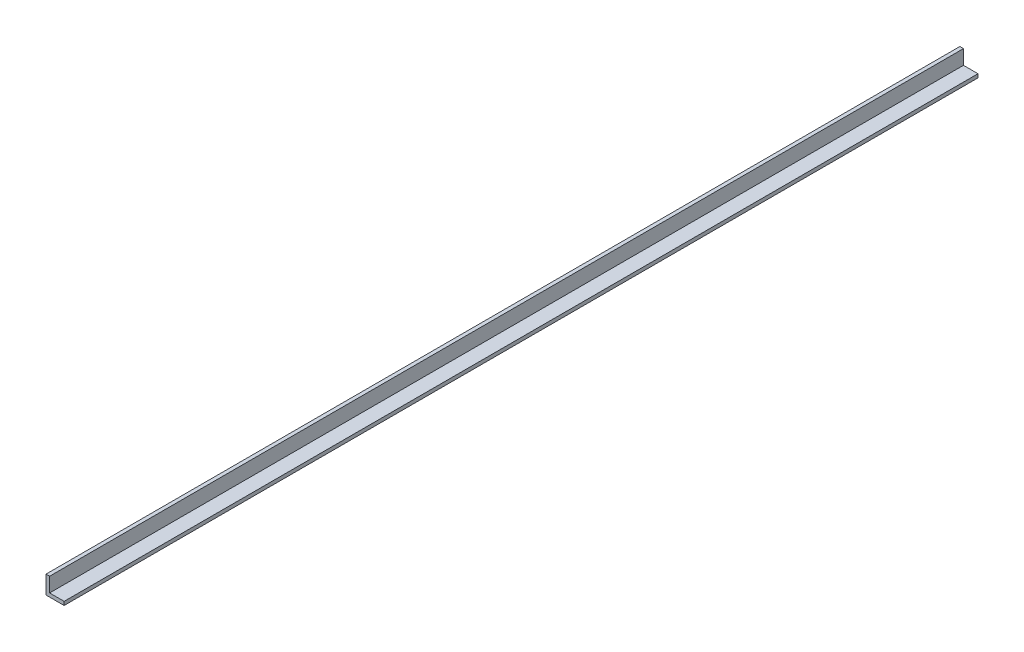
ISO-10303-21;
HEADER;
FILE_DESCRIPTION(('STEP AP214'),'2;1');
FILE_NAME('part.step','',(''),(''),'','','');
FILE_SCHEMA(('AUTOMOTIVE_DESIGN { 1 0 10303 214 1 1 1 1 }'));
ENDSEC;
DATA;
#1=APPLICATION_CONTEXT('core data for automotive mechanical design processes');
#2=APPLICATION_PROTOCOL_DEFINITION('international standard','automotive_design',2000,#1);
#3=PRODUCT_CONTEXT('',#1,'mechanical');
#4=PRODUCT('Part','Part','',(#3));
#5=PRODUCT_RELATED_PRODUCT_CATEGORY('part','',(#4));
#6=PRODUCT_DEFINITION_FORMATION('','',#4);
#7=PRODUCT_DEFINITION_CONTEXT('part definition',#1,'design');
#8=PRODUCT_DEFINITION('design','',#6,#7);
#9=PRODUCT_DEFINITION_SHAPE('','',#8);
#10=(LENGTH_UNIT() NAMED_UNIT(*) SI_UNIT(.MILLI.,.METRE.));
#11=(NAMED_UNIT(*) PLANE_ANGLE_UNIT() SI_UNIT($,.RADIAN.));
#12=(NAMED_UNIT(*) SI_UNIT($,.STERADIAN.) SOLID_ANGLE_UNIT());
#13=UNCERTAINTY_MEASURE_WITH_UNIT(LENGTH_MEASURE(1.E-05),#10,'distance_accuracy_value','');
#14=(GEOMETRIC_REPRESENTATION_CONTEXT(3) GLOBAL_UNCERTAINTY_ASSIGNED_CONTEXT((#13)) GLOBAL_UNIT_ASSIGNED_CONTEXT((#10,
#11,#12)) REPRESENTATION_CONTEXT('',''));
#15=CARTESIAN_POINT('',(0.,0.,0.));
#16=DIRECTION('',(0.,0.,1.));
#17=DIRECTION('',(1.,0.,0.));
#18=AXIS2_PLACEMENT_3D('',#15,#16,#17);
#19=CARTESIAN_POINT('',(-5.99999999999999,20.,1008.));
#20=DIRECTION('',(0.,-1.,0.));
#21=DIRECTION('',(1.,0.,0.));
#22=AXIS2_PLACEMENT_3D('',#19,#20,#21);
#23=PLANE('',#22);
#24=DIRECTION('',(-1.,0.,0.));
#25=VECTOR('',#24,1.);
#26=CARTESIAN_POINT('',(-5.99999999999999,20.,0.));
#27=LINE('',#26,#25);
#28=CARTESIAN_POINT('',(-5.99999999999999,20.,0.));
#29=VERTEX_POINT('',#28);
#30=CARTESIAN_POINT('',(-10.,20.,0.));
#31=VERTEX_POINT('',#30);
#32=EDGE_CURVE('E117',#29,#31,#27,.T.);
#33=ORIENTED_EDGE('',*,*,#32,.T.);
#34=DIRECTION('',(0.,0.,-1.));
#35=VECTOR('',#34,1.);
#36=CARTESIAN_POINT('',(-10.,20.,1008.));
#37=LINE('',#36,#35);
#38=CARTESIAN_POINT('',(-10.,20.,1008.));
#39=VERTEX_POINT('',#38);
#40=EDGE_CURVE('E11',#39,#31,#37,.T.);
#41=ORIENTED_EDGE('',*,*,#40,.F.);
#42=DIRECTION('',(-1.,0.,0.));
#43=VECTOR('',#42,1.);
#44=CARTESIAN_POINT('',(-5.99999999999999,20.,1008.));
#45=LINE('',#44,#43);
#46=CARTESIAN_POINT('',(-5.99999999999999,20.,1008.));
#47=VERTEX_POINT('',#46);
#48=EDGE_CURVE('E127',#47,#39,#45,.T.);
#49=ORIENTED_EDGE('',*,*,#48,.F.);
#50=DIRECTION('',(0.,0.,-1.));
#51=VECTOR('',#50,1.);
#52=CARTESIAN_POINT('',(-5.99999999999999,20.,1008.));
#53=LINE('',#52,#51);
#54=EDGE_CURVE('E113',#47,#29,#53,.T.);
#55=ORIENTED_EDGE('',*,*,#54,.T.);
#56=EDGE_LOOP('',(#33,#41,#49,#55));
#57=FACE_BOUND('',#56,.T.);
#58=ADVANCED_FACE('F33',(#57),#23,.F.);
#59=CARTESIAN_POINT('',(-10.,20.,1008.));
#60=DIRECTION('',(1.,0.,0.));
#61=DIRECTION('',(0.,1.,0.));
#62=AXIS2_PLACEMENT_3D('',#59,#60,#61);
#63=PLANE('',#62);
#64=DIRECTION('',(0.,-1.,0.));
#65=VECTOR('',#64,1.);
#66=CARTESIAN_POINT('',(-10.,20.,0.));
#67=LINE('',#66,#65);
#68=CARTESIAN_POINT('',(-10.,0.,0.));
#69=VERTEX_POINT('',#68);
#70=EDGE_CURVE('E120',#31,#69,#67,.T.);
#71=ORIENTED_EDGE('',*,*,#70,.T.);
#72=DIRECTION('',(0.,0.,-1.));
#73=VECTOR('',#72,1.);
#74=CARTESIAN_POINT('',(-10.,0.,1008.));
#75=LINE('',#74,#73);
#76=CARTESIAN_POINT('',(-10.,0.,1008.));
#77=VERTEX_POINT('',#76);
#78=EDGE_CURVE('E41',#77,#69,#75,.T.);
#79=ORIENTED_EDGE('',*,*,#78,.F.);
#80=DIRECTION('',(0.,-1.,0.));
#81=VECTOR('',#80,1.);
#82=CARTESIAN_POINT('',(-10.,20.,1008.));
#83=LINE('',#82,#81);
#84=EDGE_CURVE('E86',#39,#77,#83,.T.);
#85=ORIENTED_EDGE('',*,*,#84,.F.);
#86=ORIENTED_EDGE('',*,*,#40,.T.);
#87=EDGE_LOOP('',(#71,#79,#85,#86));
#88=FACE_BOUND('',#87,.T.);
#89=ADVANCED_FACE('F151',(#88),#63,.F.);
#90=CARTESIAN_POINT('',(-10.,0.,1008.));
#91=DIRECTION('',(0.,1.,0.));
#92=DIRECTION('',(-1.,0.,0.));
#93=AXIS2_PLACEMENT_3D('',#90,#91,#92);
#94=PLANE('',#93);
#95=DIRECTION('',(1.,0.,0.));
#96=VECTOR('',#95,1.);
#97=CARTESIAN_POINT('',(-10.,0.,0.));
#98=LINE('',#97,#96);
#99=CARTESIAN_POINT('',(10.,0.,0.));
#100=VERTEX_POINT('',#99);
#101=EDGE_CURVE('E122',#69,#100,#98,.T.);
#102=ORIENTED_EDGE('',*,*,#101,.T.);
#103=DIRECTION('',(0.,0.,-1.));
#104=VECTOR('',#103,1.);
#105=CARTESIAN_POINT('',(10.,0.,1008.));
#106=LINE('',#105,#104);
#107=CARTESIAN_POINT('',(10.,0.,1008.));
#108=VERTEX_POINT('',#107);
#109=EDGE_CURVE('E108',#108,#100,#106,.T.);
#110=ORIENTED_EDGE('',*,*,#109,.F.);
#111=DIRECTION('',(1.,0.,0.));
#112=VECTOR('',#111,1.);
#113=CARTESIAN_POINT('',(-10.,0.,1008.));
#114=LINE('',#113,#112);
#115=EDGE_CURVE('E99',#77,#108,#114,.T.);
#116=ORIENTED_EDGE('',*,*,#115,.F.);
#117=ORIENTED_EDGE('',*,*,#78,.T.);
#118=EDGE_LOOP('',(#102,#110,#116,#117));
#119=FACE_BOUND('',#118,.T.);
#120=ADVANCED_FACE('F133',(#119),#94,.F.);
#121=CARTESIAN_POINT('',(10.,0.,1008.));
#122=DIRECTION('',(-1.,0.,0.));
#123=DIRECTION('',(0.,0.,1.));
#124=AXIS2_PLACEMENT_3D('',#121,#122,#123);
#125=PLANE('',#124);
#126=DIRECTION('',(0.,1.,0.));
#127=VECTOR('',#126,1.);
#128=CARTESIAN_POINT('',(10.,0.,0.));
#129=LINE('',#128,#127);
#130=CARTESIAN_POINT('',(10.,4.,0.));
#131=VERTEX_POINT('',#130);
#132=EDGE_CURVE('E107',#100,#131,#129,.T.);
#133=ORIENTED_EDGE('',*,*,#132,.T.);
#134=DIRECTION('',(0.,0.,-1.));
#135=VECTOR('',#134,1.);
#136=CARTESIAN_POINT('',(10.,4.,1008.));
#137=LINE('',#136,#135);
#138=CARTESIAN_POINT('',(10.,4.,1008.));
#139=VERTEX_POINT('',#138);
#140=EDGE_CURVE('E104',#139,#131,#137,.T.);
#141=ORIENTED_EDGE('',*,*,#140,.F.);
#142=DIRECTION('',(0.,1.,0.));
#143=VECTOR('',#142,1.);
#144=CARTESIAN_POINT('',(10.,0.,1008.));
#145=LINE('',#144,#143);
#146=EDGE_CURVE('E93',#108,#139,#145,.T.);
#147=ORIENTED_EDGE('',*,*,#146,.F.);
#148=ORIENTED_EDGE('',*,*,#109,.T.);
#149=EDGE_LOOP('',(#133,#141,#147,#148));
#150=FACE_BOUND('',#149,.T.);
#151=ADVANCED_FACE('F105',(#150),#125,.F.);
#152=CARTESIAN_POINT('',(10.,4.,1008.));
#153=DIRECTION('',(0.,-1.,0.));
#154=DIRECTION('',(0.,0.,-1.));
#155=AXIS2_PLACEMENT_3D('',#152,#153,#154);
#156=PLANE('',#155);
#157=DIRECTION('',(-1.,0.,0.));
#158=VECTOR('',#157,1.);
#159=CARTESIAN_POINT('',(10.,4.,0.));
#160=LINE('',#159,#158);
#161=CARTESIAN_POINT('',(-5.99999999999999,4.,0.));
#162=VERTEX_POINT('',#161);
#163=EDGE_CURVE('E72',#131,#162,#160,.T.);
#164=ORIENTED_EDGE('',*,*,#163,.T.);
#165=DIRECTION('',(0.,0.,-1.));
#166=VECTOR('',#165,1.);
#167=CARTESIAN_POINT('',(-5.99999999999999,4.,1008.));
#168=LINE('',#167,#166);
#169=CARTESIAN_POINT('',(-5.99999999999999,4.,1008.));
#170=VERTEX_POINT('',#169);
#171=EDGE_CURVE('E109',#170,#162,#168,.T.);
#172=ORIENTED_EDGE('',*,*,#171,.F.);
#173=DIRECTION('',(-1.,0.,0.));
#174=VECTOR('',#173,1.);
#175=CARTESIAN_POINT('',(10.,4.,1008.));
#176=LINE('',#175,#174);
#177=EDGE_CURVE('E97',#139,#170,#176,.T.);
#178=ORIENTED_EDGE('',*,*,#177,.F.);
#179=ORIENTED_EDGE('',*,*,#140,.T.);
#180=EDGE_LOOP('',(#164,#172,#178,#179));
#181=FACE_BOUND('',#180,.T.);
#182=ADVANCED_FACE('F111',(#181),#156,.F.);
#183=CARTESIAN_POINT('',(-5.99999999999999,4.,1008.));
#184=DIRECTION('',(-1.,0.,0.));
#185=DIRECTION('',(0.,0.,1.));
#186=AXIS2_PLACEMENT_3D('',#183,#184,#185);
#187=PLANE('',#186);
#188=DIRECTION('',(0.,1.,0.));
#189=VECTOR('',#188,1.);
#190=CARTESIAN_POINT('',(-5.99999999999999,4.,0.));
#191=LINE('',#190,#189);
#192=EDGE_CURVE('E78',#162,#29,#191,.T.);
#193=ORIENTED_EDGE('',*,*,#192,.T.);
#194=ORIENTED_EDGE('',*,*,#54,.F.);
#195=DIRECTION('',(0.,1.,0.));
#196=VECTOR('',#195,1.);
#197=CARTESIAN_POINT('',(-5.99999999999999,4.,1008.));
#198=LINE('',#197,#196);
#199=EDGE_CURVE('E49',#170,#47,#198,.T.);
#200=ORIENTED_EDGE('',*,*,#199,.F.);
#201=ORIENTED_EDGE('',*,*,#171,.T.);
#202=EDGE_LOOP('',(#193,#194,#200,#201));
#203=FACE_BOUND('',#202,.T.);
#204=ADVANCED_FACE('F140',(#203),#187,.F.);
#205=CARTESIAN_POINT('',(0.,0.,1008.));
#206=DIRECTION('',(0.,0.,1.));
#207=DIRECTION('',(1.,0.,0.));
#208=AXIS2_PLACEMENT_3D('',#205,#206,#207);
#209=PLANE('',#208);
#210=ORIENTED_EDGE('',*,*,#48,.T.);
#211=ORIENTED_EDGE('',*,*,#84,.T.);
#212=ORIENTED_EDGE('',*,*,#115,.T.);
#213=ORIENTED_EDGE('',*,*,#146,.T.);
#214=ORIENTED_EDGE('',*,*,#177,.T.);
#215=ORIENTED_EDGE('',*,*,#199,.T.);
#216=EDGE_LOOP('',(#210,#211,#212,#213,#214,#215));
#217=FACE_BOUND('',#216,.T.);
#218=ADVANCED_FACE('F95',(#217),#209,.T.);
#219=CARTESIAN_POINT('',(0.,0.,0.));
#220=DIRECTION('',(0.,0.,1.));
#221=DIRECTION('',(1.,0.,0.));
#222=AXIS2_PLACEMENT_3D('',#219,#220,#221);
#223=PLANE('',#222);
#224=ORIENTED_EDGE('',*,*,#32,.F.);
#225=ORIENTED_EDGE('',*,*,#192,.F.);
#226=ORIENTED_EDGE('',*,*,#163,.F.);
#227=ORIENTED_EDGE('',*,*,#132,.F.);
#228=ORIENTED_EDGE('',*,*,#101,.F.);
#229=ORIENTED_EDGE('',*,*,#70,.F.);
#230=EDGE_LOOP('',(#224,#225,#226,#227,#228,#229));
#231=FACE_BOUND('',#230,.T.);
#232=ADVANCED_FACE('F136',(#231),#223,.F.);
#233=CLOSED_SHELL('',(#58,#89,#120,#151,#182,#204,#218,#232));
#234=MANIFOLD_SOLID_BREP('B2',#233);
#235=ADVANCED_BREP_SHAPE_REPRESENTATION('',(#18,#234),#14);
#236=SHAPE_DEFINITION_REPRESENTATION(#9,#235);
ENDSEC;
END-ISO-10303-21;
